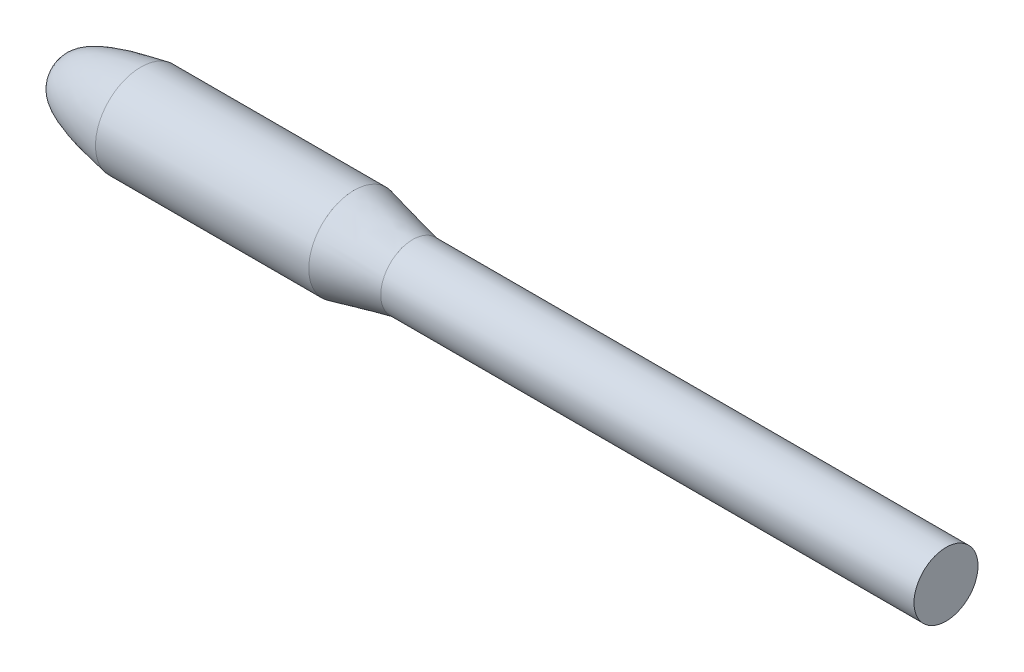
ISO-10303-21;
HEADER;
FILE_DESCRIPTION(('STEP AP214'),'2;1');
FILE_NAME('part.step','',(''),(''),'','','');
FILE_SCHEMA(('AUTOMOTIVE_DESIGN { 1 0 10303 214 1 1 1 1 }'));
ENDSEC;
DATA;
#1=APPLICATION_CONTEXT('core data for automotive mechanical design processes');
#2=APPLICATION_PROTOCOL_DEFINITION('international standard','automotive_design',2000,#1);
#3=PRODUCT_CONTEXT('',#1,'mechanical');
#4=PRODUCT('Part','Part','',(#3));
#5=PRODUCT_RELATED_PRODUCT_CATEGORY('part','',(#4));
#6=PRODUCT_DEFINITION_FORMATION('','',#4);
#7=PRODUCT_DEFINITION_CONTEXT('part definition',#1,'design');
#8=PRODUCT_DEFINITION('design','',#6,#7);
#9=PRODUCT_DEFINITION_SHAPE('','',#8);
#10=(LENGTH_UNIT() NAMED_UNIT(*) SI_UNIT(.MILLI.,.METRE.));
#11=(NAMED_UNIT(*) PLANE_ANGLE_UNIT() SI_UNIT($,.RADIAN.));
#12=(NAMED_UNIT(*) SI_UNIT($,.STERADIAN.) SOLID_ANGLE_UNIT());
#13=UNCERTAINTY_MEASURE_WITH_UNIT(LENGTH_MEASURE(1.E-05),#10,'distance_accuracy_value','');
#14=(GEOMETRIC_REPRESENTATION_CONTEXT(3) GLOBAL_UNCERTAINTY_ASSIGNED_CONTEXT((#13)) GLOBAL_UNIT_ASSIGNED_CONTEXT((#10,
#11,#12)) REPRESENTATION_CONTEXT('',''));
#15=CARTESIAN_POINT('',(0.,0.,0.));
#16=DIRECTION('',(0.,0.,1.));
#17=DIRECTION('',(1.,0.,0.));
#18=AXIS2_PLACEMENT_3D('',#15,#16,#17);
#19=CARTESIAN_POINT('',(150.,85.,0.));
#20=CARTESIAN_POINT('',(149.933332963086,84.9886635500988,0.));
#21=CARTESIAN_POINT('',(149.733326586977,84.9546533050415,0.));
#22=CARTESIAN_POINT('',(149.399989369755,84.8978766325405,0.));
#23=CARTESIAN_POINT('',(148.333178957117,84.7158387850307,0.));
#24=CARTESIAN_POINT('',(145.198462088796,84.1774153358454,0.));
#25=CARTESIAN_POINT('',(140.063409966275,83.2763526334538,0.));
#26=CARTESIAN_POINT('',(133.663251007027,82.1162152380024,0.));
#27=CARTESIAN_POINT('',(127.529872228265,80.967142805754,0.));
#28=CARTESIAN_POINT('',(121.663178505039,79.8312016707734,0.));
#29=CARTESIAN_POINT('',(116.063039295925,78.7107176075573,0.));
#30=CARTESIAN_POINT('',(110.662900526555,77.5938030270026,0.));
#31=CARTESIAN_POINT('',(105.462763855211,76.481579791043,0.));
#32=CARTESIAN_POINT('',(100.46263128834,75.3753056794851,0.));
#33=CARTESIAN_POINT('',(95.6625052522908,74.2763886089064,0.));
#34=CARTESIAN_POINT('',(91.0623885711703,73.1864019299069,0.));
#35=CARTESIAN_POINT('',(86.6622846143895,72.1071001859247,0.));
#36=CARTESIAN_POINT('',(82.4621970688495,71.0404360120572,0.));
#37=CARTESIAN_POINT('',(78.46213040735,69.9885759442398,0.));
#38=CARTESIAN_POINT('',(74.6620888756832,68.9539183462456,0.));
#39=CARTESIAN_POINT('',(70.9951359048108,67.9202347447893,0.));
#40=CARTESIAN_POINT('',(67.4614975977933,66.888166733954,0.));
#41=CARTESIAN_POINT('',(64.0614958695097,65.8583803580709,0.));
#42=CARTESIAN_POINT('',(60.8615392806008,64.8535734629751,0.));
#43=CARTESIAN_POINT('',(57.7946028227797,63.8555508898842,0.));
#44=CARTESIAN_POINT('',(54.8609921874534,62.8656161036514,0.));
#45=CARTESIAN_POINT('',(51.9940338099678,61.8616712061645,0.));
#46=CARTESIAN_POINT('',(49.2604049333765,60.8676692947749,0.));
#47=CARTESIAN_POINT('',(46.6606093325559,59.8853207836057,0.));
#48=CARTESIAN_POINT('',(44.193707143034,58.91752183605,0.));
#49=CARTESIAN_POINT('',(41.8601513478097,57.9665916899193,0.));
#50=CARTESIAN_POINT('',(39.5932702297775,57.0065626810714,0.));
#51=CARTESIAN_POINT('',(37.4597469179254,56.0672012122168,0.));
#52=CARTESIAN_POINT('',(35.3929098213764,55.120726442385,0.));
#53=CARTESIAN_POINT('',(33.4594457975844,54.1996284289504,0.));
#54=CARTESIAN_POINT('',(31.5926828604072,53.2741850342985,0.));
#55=CARTESIAN_POINT('',(29.7917203934432,52.3450566509747,0.));
#56=CARTESIAN_POINT('',(28.0582927499576,51.412163763309,0.));
#57=CARTESIAN_POINT('',(26.3915877567857,50.4762452509048,0.));
#58=CARTESIAN_POINT('',(24.790441055548,49.538186317748,0.));
#59=CARTESIAN_POINT('',(23.2571035986549,48.5983671502348,0.));
#60=CARTESIAN_POINT('',(21.7905220441791,47.6578617647926,0.));
#61=CARTESIAN_POINT('',(20.3891988556301,46.7178909713236,0.));
#62=CARTESIAN_POINT('',(18.9876022764676,45.731471931952,0.));
#63=CARTESIAN_POINT('',(17.6543809034163,44.74350681092,0.));
#64=CARTESIAN_POINT('',(16.3879753215997,43.7552947252546,0.));
#65=CARTESIAN_POINT('',(15.1861706225691,42.7681942447512,0.));
#66=CARTESIAN_POINT('',(13.9839603207363,41.7246311699187,0.));
#67=CARTESIAN_POINT('',(12.8510297890443,40.6803522728424,0.));
#68=CARTESIAN_POINT('',(11.7850117433407,39.6369280621689,0.));
#69=CARTESIAN_POINT('',(10.7826088420303,38.595746541503,0.));
#70=CARTESIAN_POINT('',(9.85034460299619,37.5624855583513,0.));
#71=CARTESIAN_POINT('',(8.98508387628335,36.5400134110784,0.));
#72=CARTESIAN_POINT('',(8.18277044424618,35.530963645593,0.));
#73=CARTESIAN_POINT('',(7.45148151123188,34.5460949578217,0.));
#74=CARTESIAN_POINT('',(6.78722692689446,33.5906242451195,0.));
#75=CARTESIAN_POINT('',(6.18542963153958,32.6697324916292,0.));
#76=CARTESIAN_POINT('',(5.58321858881817,31.6834570840307,0.));
#77=CARTESIAN_POINT('',(5.05331092004136,30.7477807598956,0.));
#78=CARTESIAN_POINT('',(4.59033561481038,29.8717269742659,0.));
#79=CARTESIAN_POINT('',(4.18913861433532,29.0648174479734,0.));
#80=CARTESIAN_POINT('',(3.78768343871713,28.2015669942254,0.));
#81=CARTESIAN_POINT('',(3.38587909275829,27.2712617269582,0.));
#82=CARTESIAN_POINT('',(2.98358538597319,26.2595011533982,0.));
#83=CARTESIAN_POINT('',(2.58057365558414,25.1461751794452,0.));
#84=CARTESIAN_POINT('',(2.25380855212399,24.1399794566434,0.));
#85=CARTESIAN_POINT('',(1.99350716667378,23.2610838618401,0.));
#86=CARTESIAN_POINT('',(1.79270386413704,22.5337460669954,0.));
#87=CARTESIAN_POINT('',(1.59169883745854,21.7465290909666,0.));
#88=CARTESIAN_POINT('',(1.39040426817789,20.8856793238557,0.));
#89=CARTESIAN_POINT('',(1.1886708633946,19.9315369758068,0.));
#90=CARTESIAN_POINT('',(0.986227589019432,18.8542986640155,0.));
#91=CARTESIAN_POINT('',(0.782493434811414,17.6048221885444,0.));
#92=CARTESIAN_POINT('',(0.57609845251901,16.0904961831353,0.));
#93=CARTESIAN_POINT('',(0.361573767311703,14.0857223573754,0.));
#94=CARTESIAN_POINT('',(-0.0274375794679944,8.68495812603642,0.));
#95=CARTESIAN_POINT('',(-0.01229422515827,3.89155431207734,0.));
#96=CARTESIAN_POINT('',(0.,0.,0.));
#97=B_SPLINE_CURVE_WITH_KNOTS('',3,(#19,#20,#21,#22,#23,#24,#25,#26,#27,#28,#29,#30,#31,#32,#33,
#34,#35,#36,#37,#38,#39,#40,#41,#42,#43,#44,#45,#46,#47,#48,#49,#50,#51,#52,#53,#54,#55,#56,#57,
#58,#59,#60,#61,#62,#63,#64,#65,#66,#67,#68,#69,#70,#71,#72,#73,#74,#75,#76,#77,#78,#79,#80,#81,
#82,#83,#84,#85,#86,#87,#88,#89,#90,#91,#92,#93,#94,#95,#96),.UNSPECIFIED.,.F.,.F.,(4,1,1,1,1,1,
1,1,1,1,1,1,1,1,1,1,1,1,1,1,1,1,1,1,1,1,1,1,1,1,1,1,1,1,1,1,1,1,1,1,1,1,1,1,1,1,1,1,1,1,1,1,1,1,
1,1,1,1,1,1,1,1,1,1,1,1,1,1,1,1,1,1,1,1,1,4),(0.,0.0010687252586431,0.00320626018393633,
0.00534390825207476,0.0181722136864929,0.0534725459687915,0.0877375176574445,0.120967753154723,
0.152090007337628,0.182175910046259,0.21122563995096,0.2392392707454,0.266216745901022,
0.292157849275824,0.317062171203436,0.340929069772287,0.363757627150992,0.385546601045925,
0.406294371714183,0.425998885424918,0.445756768666262,0.464472231486975,0.482142111039781,
0.498762544311735,0.515442943349823,0.5310723970131,0.546768661029466,0.561411566738944,
0.574993781870311,0.588647474112505,0.601234494645023,0.613898825914661,0.625487998856008,
0.637159700915589,0.647744392134459,0.658415550608988,0.669185411269821,0.678853400673226,
0.688623655317672,0.698511438846342,0.707274252510522,0.716156589654469,0.725177123576283,
0.734358941510187,0.742379190684298,0.750561858118709,0.758935380151752,0.767535832672319,
0.774909459107764,0.782507468033389,0.790374367643702,0.796900107721607,0.803673701632407,
0.810745267983144,0.816283575468111,0.822062632339849,0.828129061978545,0.834544121777166,
0.839054210787859,0.843787411970255,0.848784507322367,0.854098616344942,0.859800864190407,
0.86598981856289,0.872808240763533,0.876517565671207,0.880475407967659,0.884732346306742,
0.889357005298599,0.894446203076064,0.900143667243012,0.906678064851421,0.9144515629978,
0.924294212224039,0.938537791451912,1.),.UNSPECIFIED.);
#98=CARTESIAN_POINT('',(0.,0.,0.));
#99=DIRECTION('',(1.,0.,0.));
#100=AXIS1_PLACEMENT('',#98,#99);
#101=SURFACE_OF_REVOLUTION('',#97,#100);
#102=CARTESIAN_POINT('',(0.,0.,0.));
#103=VERTEX_POINT('',#102);
#104=VERTEX_LOOP('',#103);
#105=FACE_BOUND('',#104,.T.);
#106=CARTESIAN_POINT('',(150.,0.,0.));
#107=DIRECTION('',(1.,0.,0.));
#108=DIRECTION('',(0.,0.,-1.));
#109=AXIS2_PLACEMENT_3D('',#106,#107,#108);
#110=CIRCLE('',#109,85.);
#111=CARTESIAN_POINT('',(150.,0.,-85.));
#112=VERTEX_POINT('',#111);
#113=EDGE_CURVE('E12',#112,#112,#110,.T.);
#114=ORIENTED_EDGE('',*,*,#113,.F.);
#115=EDGE_LOOP('',(#114));
#116=FACE_BOUND('',#115,.T.);
#117=ADVANCED_FACE('F41',(#105,#116),#101,.F.);
#118=CARTESIAN_POINT('',(550.,0.,0.));
#119=DIRECTION('',(-1.,0.,0.));
#120=DIRECTION('',(0.,0.,1.));
#121=AXIS2_PLACEMENT_3D('',#118,#119,#120);
#122=CYLINDRICAL_SURFACE('',#121,85.);
#123=CARTESIAN_POINT('',(550.,0.,0.));
#124=DIRECTION('',(-1.,0.,0.));
#125=DIRECTION('',(0.,0.,1.));
#126=AXIS2_PLACEMENT_3D('',#123,#124,#125);
#127=CIRCLE('',#126,85.);
#128=CARTESIAN_POINT('',(550.,45.6354277582449,71.7105831333284));
#129=VERTEX_POINT('',#128);
#130=EDGE_CURVE('E50',#129,#129,#127,.F.);
#131=ORIENTED_EDGE('',*,*,#130,.F.);
#132=EDGE_LOOP('',(#131));
#133=FACE_BOUND('',#132,.T.);
#134=ORIENTED_EDGE('',*,*,#113,.T.);
#135=EDGE_LOOP('',(#134));
#136=FACE_BOUND('',#135,.T.);
#137=ADVANCED_FACE('F56',(#133,#136),#122,.T.);
#138=CARTESIAN_POINT('',(660.,21.1379430814852,56.1532489023021));
#139=CARTESIAN_POINT('',(550.,45.6354277582449,71.7105831333284));
#140=CARTESIAN_POINT('',(660.,133.444440886089,13.8773627393316));
#141=CARTESIAN_POINT('',(550.,189.056594024902,-19.5602723831614));
#142=CARTESIAN_POINT('',(660.,91.1685547231189,-98.4291350652726));
#143=CARTESIAN_POINT('',(550.,97.7857385084119,-162.981438649818));
#144=CARTESIAN_POINT('',(660.,-21.1379430814852,-56.1532489023021));
#145=CARTESIAN_POINT('',(550.,-45.6354277582449,-71.7105831333284));
#146=CARTESIAN_POINT('',(660.,-133.444440886089,-13.8773627393316));
#147=CARTESIAN_POINT('',(550.,-189.056594024902,19.5602723831614));
#148=CARTESIAN_POINT('',(660.,-91.1685547231189,98.4291350652725));
#149=CARTESIAN_POINT('',(550.,-97.7857385084119,162.981438649818));
#150=CARTESIAN_POINT('',(660.,21.1379430814852,56.1532489023021));
#151=CARTESIAN_POINT('',(550.,45.6354277582449,71.7105831333284));
#152=(BOUNDED_SURFACE() B_SPLINE_SURFACE(3,1,((#138,#139),(#140,#141),(#142,#143),(#144,#145),
(#146,#147),(#148,#149),(#150,#151)),.UNSPECIFIED.,.T.,.F.,.F.) B_SPLINE_SURFACE_WITH_KNOTS((4,
3,4),(2,2),(0.,0.5,1.),(0.,1.),
.UNSPECIFIED.) GEOMETRIC_REPRESENTATION_ITEM() RATIONAL_B_SPLINE_SURFACE(((1.,1.),
(0.333333333333333,0.333333333333333),(0.333333333333333,0.333333333333333),(1.,1.),
(0.333333333333334,0.333333333333334),(0.333333333333334,0.333333333333334),(1.,1.))) REPRESENTATION_ITEM('') SURFACE());
#153=CARTESIAN_POINT('',(660.,0.,0.));
#154=DIRECTION('',(1.,0.,0.));
#155=DIRECTION('',(0.,0.,-1.));
#156=AXIS2_PLACEMENT_3D('',#153,#154,#155);
#157=CIRCLE('',#156,60.);
#158=CARTESIAN_POINT('',(660.,21.1379430814852,56.1532489023021));
#159=VERTEX_POINT('',#158);
#160=EDGE_CURVE('E45',#159,#159,#157,.T.);
#161=CARTESIAN_POINT('',(660.,21.1379430814852,56.1532489023021));
#162=CARTESIAN_POINT('',(658.854166666667,21.3931252135348,56.3153044672086));
#163=CARTESIAN_POINT('',(657.708333333333,21.6483073455844,56.4773600321151));
#164=CARTESIAN_POINT('',(655.416666666667,22.1586716096836,56.8014711619282));
#165=CARTESIAN_POINT('',(654.270833333333,22.4138537417331,56.9635267268347));
#166=CARTESIAN_POINT('',(651.979166666667,22.9242180058323,57.2876378566478));
#167=CARTESIAN_POINT('',(650.833333333333,23.1794001378819,57.4496934215543));
#168=CARTESIAN_POINT('',(648.541666666667,23.689764401981,57.7738045513673));
#169=CARTESIAN_POINT('',(647.395833333333,23.9449465340306,57.9358601162739));
#170=CARTESIAN_POINT('',(645.104166666667,24.4553107981298,58.2599712460869));
#171=CARTESIAN_POINT('',(643.958333333333,24.7104929301794,58.4220268109934));
#172=CARTESIAN_POINT('',(641.666666666667,25.2208571942785,58.7461379408065));
#173=CARTESIAN_POINT('',(640.520833333333,25.4760393263281,58.908193505713));
#174=CARTESIAN_POINT('',(638.229166666667,25.9864035904273,59.232304635526));
#175=CARTESIAN_POINT('',(637.083333333333,26.2415857224768,59.3943602004326));
#176=CARTESIAN_POINT('',(634.791666666667,26.751949986576,59.7184713302456));
#177=CARTESIAN_POINT('',(633.645833333333,27.0071321186256,59.8805268951521));
#178=CARTESIAN_POINT('',(631.354166666667,27.5174963827247,60.2046380249652));
#179=CARTESIAN_POINT('',(630.208333333333,27.7726785147743,60.3666935898717));
#180=CARTESIAN_POINT('',(627.916666666667,28.2830427788735,60.6908047196848));
#181=CARTESIAN_POINT('',(626.770833333333,28.5382249109231,60.8528602845913));
#182=CARTESIAN_POINT('',(624.479166666667,29.0485891750222,61.1769714144043));
#183=CARTESIAN_POINT('',(623.333333333333,29.3037713070718,61.3390269793109));
#184=CARTESIAN_POINT('',(621.041666666667,29.814135571171,61.6631381091239));
#185=CARTESIAN_POINT('',(619.895833333333,30.0693177032205,61.8251936740304));
#186=CARTESIAN_POINT('',(617.604166666667,30.5796819673197,62.1493048038435));
#187=CARTESIAN_POINT('',(616.458333333333,30.8348640993693,62.31136036875));
#188=CARTESIAN_POINT('',(614.166666666667,31.3452283634684,62.6354714985631));
#189=CARTESIAN_POINT('',(613.020833333333,31.600410495518,62.7975270634696));
#190=CARTESIAN_POINT('',(610.729166666667,32.1107747596172,63.1216381932826));
#191=CARTESIAN_POINT('',(609.583333333333,32.3659568916668,63.2836937581892));
#192=CARTESIAN_POINT('',(607.291666666667,32.8763211557659,63.6078048880022));
#193=CARTESIAN_POINT('',(606.145833333333,33.1315032878155,63.7698604529087));
#194=CARTESIAN_POINT('',(603.854166666667,33.6418675519147,64.0939715827218));
#195=CARTESIAN_POINT('',(602.708333333333,33.8970496839642,64.2560271476283));
#196=CARTESIAN_POINT('',(600.416666666667,34.4074139480634,64.5801382774413));
#197=CARTESIAN_POINT('',(599.270833333333,34.662596080113,64.7421938423479));
#198=CARTESIAN_POINT('',(596.979166666667,35.1729603442121,65.0663049721609));
#199=CARTESIAN_POINT('',(595.833333333333,35.4281424762617,65.2283605370674));
#200=CARTESIAN_POINT('',(593.541666666667,35.9385067403609,65.5524716668805));
#201=CARTESIAN_POINT('',(592.395833333333,36.1936888724105,65.714527231787));
#202=CARTESIAN_POINT('',(590.104166666667,36.7040531365096,66.0386383616001));
#203=CARTESIAN_POINT('',(588.958333333333,36.9592352685592,66.2006939265066));
#204=CARTESIAN_POINT('',(586.666666666667,37.4695995326584,66.5248050563197));
#205=CARTESIAN_POINT('',(585.520833333333,37.724781664708,66.6868606212262));
#206=CARTESIAN_POINT('',(583.229166666667,38.2351459288071,67.0109717510392));
#207=CARTESIAN_POINT('',(582.083333333333,38.4903280608567,67.1730273159457));
#208=CARTESIAN_POINT('',(579.791666666667,39.0006923249558,67.4971384457588));
#209=CARTESIAN_POINT('',(578.645833333333,39.2558744570054,67.6591940106653));
#210=CARTESIAN_POINT('',(576.354166666667,39.7662387211046,67.9833051404784));
#211=CARTESIAN_POINT('',(575.208333333333,40.0214208531542,68.1453607053849));
#212=CARTESIAN_POINT('',(572.916666666667,40.5317851172533,68.4694718351979));
#213=CARTESIAN_POINT('',(571.770833333333,40.7869672493029,68.6315274001045));
#214=CARTESIAN_POINT('',(569.479166666667,41.2973315134021,68.9556385299175));
#215=CARTESIAN_POINT('',(568.333333333333,41.5525136454516,69.117694094824));
#216=CARTESIAN_POINT('',(566.041666666667,42.0628779095508,69.4418052246371));
#217=CARTESIAN_POINT('',(564.895833333333,42.3180600416004,69.6038607895436));
#218=CARTESIAN_POINT('',(562.604166666667,42.8284243056996,69.9279719193567));
#219=CARTESIAN_POINT('',(561.458333333333,43.0836064377491,70.0900274842632));
#220=CARTESIAN_POINT('',(559.166666666667,43.5939707018483,70.4141386140762));
#221=CARTESIAN_POINT('',(558.020833333333,43.8491528338979,70.5761941789828));
#222=CARTESIAN_POINT('',(555.729166666667,44.359517097997,70.9003053087958));
#223=CARTESIAN_POINT('',(554.583333333333,44.6146992300466,71.0623608737023));
#224=CARTESIAN_POINT('',(552.291666666667,45.1250634941458,71.3864720035154));
#225=CARTESIAN_POINT('',(551.145833333333,45.3802456261954,71.5485275684219));
#226=CARTESIAN_POINT('',(550.,45.6354277582449,71.7105831333284));
#227=B_SPLINE_CURVE_WITH_KNOTS('',3,(#161,#162,#163,#164,#165,#166,#167,#168,#169,#170,#171,
#172,#173,#174,#175,#176,#177,#178,#179,#180,#181,#182,#183,#184,#185,#186,#187,#188,#189,#190,
#191,#192,#193,#194,#195,#196,#197,#198,#199,#200,#201,#202,#203,#204,#205,#206,#207,#208,#209,
#210,#211,#212,#213,#214,#215,#216,#217,#218,#219,#220,#221,#222,#223,#224,#225,#226),
.UNSPECIFIED.,.F.,.F.,(4,2,2,2,2,2,2,2,2,2,2,2,2,2,2,2,2,2,2,2,2,2,2,2,2,2,2,2,2,2,2,2,4),(0.,
3.55511259873872,7.11022519747743,10.6653377962163,14.220450394955,17.7755629936937,
21.3306755924324,24.8857881911711,28.4409007899098,31.9960133886486,35.5511259873873,
39.106238586126,42.6613511848648,46.2164637836035,49.7715763823423,53.3266889810811,
56.8818015798198,60.4369141785585,63.9920267772972,67.547139376036,71.1022519747747,
74.6573645735134,78.2124771722521,81.7675897709909,85.3227023697297,88.8778149684684,
92.4329275672071,95.9880401659458,99.5431527646845,103.098265363423,106.653377962162,
110.208490560901,113.76360315964),.UNSPECIFIED.);
#228=EDGE_CURVE('BSEAM60',#159,#129,#227,.T.);
#229=ORIENTED_EDGE('',*,*,#160,.F.);
#230=ORIENTED_EDGE('',*,*,#130,.T.);
#231=ORIENTED_EDGE('',*,*,#228,.T.);
#232=ORIENTED_EDGE('',*,*,#228,.F.);
#233=EDGE_LOOP('',(#229,#231,#230,#232));
#234=FACE_BOUND('',#233,.T.);
#235=ADVANCED_FACE('F60',(#234),#152,.T.);
#236=CARTESIAN_POINT('',(1660.,0.,0.));
#237=DIRECTION('',(-1.,0.,0.));
#238=DIRECTION('',(0.,0.,1.));
#239=AXIS2_PLACEMENT_3D('',#236,#237,#238);
#240=CYLINDRICAL_SURFACE('',#239,60.);
#241=CARTESIAN_POINT('',(1660.,0.,0.));
#242=DIRECTION('',(1.,0.,0.));
#243=DIRECTION('',(0.,0.,-1.));
#244=AXIS2_PLACEMENT_3D('',#241,#242,#243);
#245=CIRCLE('',#244,60.);
#246=CARTESIAN_POINT('',(1660.,0.,-60.));
#247=VERTEX_POINT('',#246);
#248=EDGE_CURVE('E112',#247,#247,#245,.T.);
#249=ORIENTED_EDGE('',*,*,#248,.F.);
#250=EDGE_LOOP('',(#249));
#251=FACE_BOUND('',#250,.T.);
#252=ORIENTED_EDGE('',*,*,#160,.T.);
#253=EDGE_LOOP('',(#252));
#254=FACE_BOUND('',#253,.T.);
#255=ADVANCED_FACE('F65',(#251,#254),#240,.T.);
#256=CARTESIAN_POINT('',(1660.,0.,0.));
#257=DIRECTION('',(1.,0.,0.));
#258=DIRECTION('',(0.,0.,-1.));
#259=AXIS2_PLACEMENT_3D('',#256,#257,#258);
#260=PLANE('',#259);
#261=ORIENTED_EDGE('',*,*,#248,.T.);
#262=EDGE_LOOP('',(#261));
#263=FACE_BOUND('',#262,.T.);
#264=ADVANCED_FACE('F116',(#263),#260,.T.);
#265=CLOSED_SHELL('',(#117,#137,#235,#255,#264));
#266=MANIFOLD_SOLID_BREP('B2',#265);
#267=ADVANCED_BREP_SHAPE_REPRESENTATION('',(#18,#266),#14);
#268=SHAPE_DEFINITION_REPRESENTATION(#9,#267);
ENDSEC;
END-ISO-10303-21;
